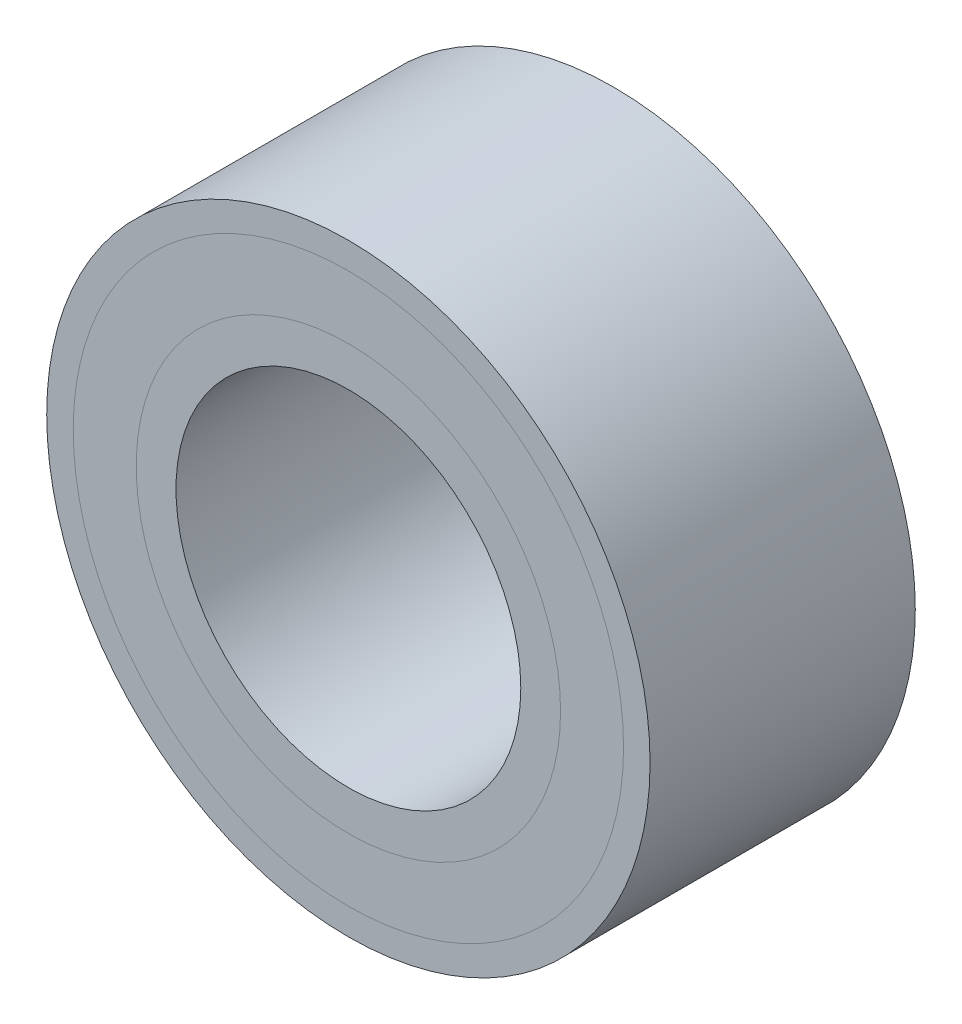
ISO-10303-21;
HEADER;
FILE_DESCRIPTION(('STEP AP214'),'2;1');
FILE_NAME('part.step','',(''),(''),'','','');
FILE_SCHEMA(('AUTOMOTIVE_DESIGN { 1 0 10303 214 1 1 1 1 }'));
ENDSEC;
DATA;
#1=APPLICATION_CONTEXT('core data for automotive mechanical design processes');
#2=APPLICATION_PROTOCOL_DEFINITION('international standard','automotive_design',2000,#1);
#3=PRODUCT_CONTEXT('',#1,'mechanical');
#4=PRODUCT('Part','Part','',(#3));
#5=PRODUCT_RELATED_PRODUCT_CATEGORY('part','',(#4));
#6=PRODUCT_DEFINITION_FORMATION('','',#4);
#7=PRODUCT_DEFINITION_CONTEXT('part definition',#1,'design');
#8=PRODUCT_DEFINITION('design','',#6,#7);
#9=PRODUCT_DEFINITION_SHAPE('','',#8);
#10=(LENGTH_UNIT() NAMED_UNIT(*) SI_UNIT(.MILLI.,.METRE.));
#11=(NAMED_UNIT(*) PLANE_ANGLE_UNIT() SI_UNIT($,.RADIAN.));
#12=(NAMED_UNIT(*) SI_UNIT($,.STERADIAN.) SOLID_ANGLE_UNIT());
#13=UNCERTAINTY_MEASURE_WITH_UNIT(LENGTH_MEASURE(1.E-05),#10,'distance_accuracy_value','');
#14=(GEOMETRIC_REPRESENTATION_CONTEXT(3) GLOBAL_UNCERTAINTY_ASSIGNED_CONTEXT((#13)) GLOBAL_UNIT_ASSIGNED_CONTEXT((#10,
#11,#12)) REPRESENTATION_CONTEXT('',''));
#15=CARTESIAN_POINT('',(0.,0.,0.));
#16=DIRECTION('',(0.,0.,1.));
#17=DIRECTION('',(1.,0.,0.));
#18=AXIS2_PLACEMENT_3D('',#15,#16,#17);
#19=CARTESIAN_POINT('',(0.,0.,40.));
#20=DIRECTION('',(0.,0.,-1.));
#21=DIRECTION('',(-1.,0.,0.));
#22=AXIS2_PLACEMENT_3D('',#19,#20,#21);
#23=CYLINDRICAL_SURFACE('',#22,32.);
#24=CARTESIAN_POINT('',(0.,0.,40.));
#25=DIRECTION('',(0.,0.,1.));
#26=DIRECTION('',(1.,0.,0.));
#27=AXIS2_PLACEMENT_3D('',#24,#25,#26);
#28=CIRCLE('',#27,32.);
#29=CARTESIAN_POINT('',(32.,0.,40.));
#30=VERTEX_POINT('',#29);
#31=EDGE_CURVE('E63',#30,#30,#28,.T.);
#32=ORIENTED_EDGE('',*,*,#31,.T.);
#33=EDGE_LOOP('',(#32));
#34=FACE_BOUND('',#33,.T.);
#35=CARTESIAN_POINT('',(0.,0.,0.));
#36=DIRECTION('',(0.,0.,1.));
#37=DIRECTION('',(1.,0.,0.));
#38=AXIS2_PLACEMENT_3D('',#35,#36,#37);
#39=CIRCLE('',#38,32.);
#40=CARTESIAN_POINT('',(32.,0.,0.));
#41=VERTEX_POINT('',#40);
#42=EDGE_CURVE('E71',#41,#41,#39,.T.);
#43=ORIENTED_EDGE('',*,*,#42,.F.);
#44=EDGE_LOOP('',(#43));
#45=FACE_BOUND('',#44,.T.);
#46=ADVANCED_FACE('F55',(#34,#45),#23,.F.);
#47=CARTESIAN_POINT('',(0.,0.,40.));
#48=DIRECTION('',(0.,0.,-1.));
#49=DIRECTION('',(-1.,0.,0.));
#50=AXIS2_PLACEMENT_3D('',#47,#48,#49);
#51=CYLINDRICAL_SURFACE('',#50,41.5);
#52=CARTESIAN_POINT('',(0.,0.,40.));
#53=DIRECTION('',(0.,0.,1.));
#54=DIRECTION('',(1.,0.,0.));
#55=AXIS2_PLACEMENT_3D('',#52,#53,#54);
#56=CIRCLE('',#55,41.5);
#57=CARTESIAN_POINT('',(41.5,0.,40.));
#58=VERTEX_POINT('',#57);
#59=EDGE_CURVE('E12',#58,#58,#56,.T.);
#60=ORIENTED_EDGE('',*,*,#59,.F.);
#61=EDGE_LOOP('',(#60));
#62=FACE_BOUND('',#61,.T.);
#63=CARTESIAN_POINT('',(0.,0.,0.));
#64=DIRECTION('',(0.,0.,1.));
#65=DIRECTION('',(1.,0.,0.));
#66=AXIS2_PLACEMENT_3D('',#63,#64,#65);
#67=CIRCLE('',#66,41.5);
#68=CARTESIAN_POINT('',(41.5,0.,0.));
#69=VERTEX_POINT('',#68);
#70=EDGE_CURVE('E58',#69,#69,#67,.T.);
#71=ORIENTED_EDGE('',*,*,#70,.T.);
#72=EDGE_LOOP('',(#71));
#73=FACE_BOUND('',#72,.T.);
#74=ADVANCED_FACE('F81',(#62,#73),#51,.T.);
#75=CARTESIAN_POINT('',(0.,0.,40.));
#76=DIRECTION('',(0.,0.,1.));
#77=DIRECTION('',(1.,0.,0.));
#78=AXIS2_PLACEMENT_3D('',#75,#76,#77);
#79=PLANE('',#78);
#80=ORIENTED_EDGE('',*,*,#31,.F.);
#81=EDGE_LOOP('',(#80));
#82=FACE_BOUND('',#81,.T.);
#83=ORIENTED_EDGE('',*,*,#59,.T.);
#84=EDGE_LOOP('',(#83));
#85=FACE_BOUND('',#84,.T.);
#86=ADVANCED_FACE('F85',(#82,#85),#79,.T.);
#87=CARTESIAN_POINT('',(0.,0.,0.));
#88=DIRECTION('',(0.,0.,1.));
#89=DIRECTION('',(1.,0.,0.));
#90=AXIS2_PLACEMENT_3D('',#87,#88,#89);
#91=PLANE('',#90);
#92=ORIENTED_EDGE('',*,*,#42,.T.);
#93=EDGE_LOOP('',(#92));
#94=FACE_BOUND('',#93,.T.);
#95=ORIENTED_EDGE('',*,*,#70,.F.);
#96=EDGE_LOOP('',(#95));
#97=FACE_BOUND('',#96,.T.);
#98=ADVANCED_FACE('F83',(#94,#97),#91,.F.);
#99=CLOSED_SHELL('',(#46,#74,#86,#98));
#100=MANIFOLD_SOLID_BREP('B2',#99);
#101=CARTESIAN_POINT('',(0.,0.,40.));
#102=DIRECTION('',(0.,0.,-1.));
#103=DIRECTION('',(-1.,0.,0.));
#104=AXIS2_PLACEMENT_3D('',#101,#102,#103);
#105=CYLINDRICAL_SURFACE('',#104,26.);
#106=CARTESIAN_POINT('',(0.,0.,40.));
#107=DIRECTION('',(0.,0.,1.));
#108=DIRECTION('',(1.,0.,0.));
#109=AXIS2_PLACEMENT_3D('',#106,#107,#108);
#110=CIRCLE('',#109,26.);
#111=CARTESIAN_POINT('',(26.,0.,40.));
#112=VERTEX_POINT('',#111);
#113=EDGE_CURVE('E137',#112,#112,#110,.T.);
#114=ORIENTED_EDGE('',*,*,#113,.T.);
#115=EDGE_LOOP('',(#114));
#116=FACE_BOUND('',#115,.T.);
#117=CARTESIAN_POINT('',(0.,0.,0.));
#118=DIRECTION('',(0.,0.,1.));
#119=DIRECTION('',(1.,0.,0.));
#120=AXIS2_PLACEMENT_3D('',#117,#118,#119);
#121=CIRCLE('',#120,26.);
#122=CARTESIAN_POINT('',(26.,0.,0.));
#123=VERTEX_POINT('',#122);
#124=EDGE_CURVE('E147',#123,#123,#121,.T.);
#125=ORIENTED_EDGE('',*,*,#124,.F.);
#126=EDGE_LOOP('',(#125));
#127=FACE_BOUND('',#126,.T.);
#128=ADVANCED_FACE('F129',(#116,#127),#105,.F.);
#129=CARTESIAN_POINT('',(0.,0.,40.));
#130=DIRECTION('',(0.,0.,-1.));
#131=DIRECTION('',(-1.,0.,0.));
#132=AXIS2_PLACEMENT_3D('',#129,#130,#131);
#133=CYLINDRICAL_SURFACE('',#132,32.);
#134=CARTESIAN_POINT('',(0.,0.,40.));
#135=DIRECTION('',(0.,0.,1.));
#136=DIRECTION('',(1.,0.,0.));
#137=AXIS2_PLACEMENT_3D('',#134,#135,#136);
#138=CIRCLE('',#137,32.);
#139=CARTESIAN_POINT('',(32.,0.,40.));
#140=VERTEX_POINT('',#139);
#141=EDGE_CURVE('E54',#140,#140,#138,.T.);
#142=ORIENTED_EDGE('',*,*,#141,.F.);
#143=EDGE_LOOP('',(#142));
#144=FACE_BOUND('',#143,.T.);
#145=CARTESIAN_POINT('',(0.,0.,0.));
#146=DIRECTION('',(0.,0.,1.));
#147=DIRECTION('',(1.,0.,0.));
#148=AXIS2_PLACEMENT_3D('',#145,#146,#147);
#149=CIRCLE('',#148,32.);
#150=CARTESIAN_POINT('',(32.,0.,0.));
#151=VERTEX_POINT('',#150);
#152=EDGE_CURVE('E132',#151,#151,#149,.T.);
#153=ORIENTED_EDGE('',*,*,#152,.T.);
#154=EDGE_LOOP('',(#153));
#155=FACE_BOUND('',#154,.T.);
#156=ADVANCED_FACE('F157',(#144,#155),#133,.T.);
#157=CARTESIAN_POINT('',(0.,0.,40.));
#158=DIRECTION('',(0.,0.,1.));
#159=DIRECTION('',(1.,0.,0.));
#160=AXIS2_PLACEMENT_3D('',#157,#158,#159);
#161=PLANE('',#160);
#162=ORIENTED_EDGE('',*,*,#113,.F.);
#163=EDGE_LOOP('',(#162));
#164=FACE_BOUND('',#163,.T.);
#165=ORIENTED_EDGE('',*,*,#141,.T.);
#166=EDGE_LOOP('',(#165));
#167=FACE_BOUND('',#166,.T.);
#168=ADVANCED_FACE('F161',(#164,#167),#161,.T.);
#169=CARTESIAN_POINT('',(0.,0.,0.));
#170=DIRECTION('',(0.,0.,1.));
#171=DIRECTION('',(1.,0.,0.));
#172=AXIS2_PLACEMENT_3D('',#169,#170,#171);
#173=PLANE('',#172);
#174=ORIENTED_EDGE('',*,*,#124,.T.);
#175=EDGE_LOOP('',(#174));
#176=FACE_BOUND('',#175,.T.);
#177=ORIENTED_EDGE('',*,*,#152,.F.);
#178=EDGE_LOOP('',(#177));
#179=FACE_BOUND('',#178,.T.);
#180=ADVANCED_FACE('F159',(#176,#179),#173,.F.);
#181=CLOSED_SHELL('',(#128,#156,#168,#180));
#182=MANIFOLD_SOLID_BREP('B7',#181);
#183=CARTESIAN_POINT('',(0.,0.,40.));
#184=DIRECTION('',(0.,0.,-1.));
#185=DIRECTION('',(-1.,0.,0.));
#186=AXIS2_PLACEMENT_3D('',#183,#184,#185);
#187=CYLINDRICAL_SURFACE('',#186,41.5);
#188=CARTESIAN_POINT('',(0.,0.,40.));
#189=DIRECTION('',(0.,0.,1.));
#190=DIRECTION('',(1.,0.,0.));
#191=AXIS2_PLACEMENT_3D('',#188,#189,#190);
#192=CIRCLE('',#191,41.5);
#193=CARTESIAN_POINT('',(41.5,0.,40.));
#194=VERTEX_POINT('',#193);
#195=EDGE_CURVE('E211',#194,#194,#192,.T.);
#196=ORIENTED_EDGE('',*,*,#195,.T.);
#197=EDGE_LOOP('',(#196));
#198=FACE_BOUND('',#197,.T.);
#199=CARTESIAN_POINT('',(0.,0.,0.));
#200=DIRECTION('',(0.,0.,1.));
#201=DIRECTION('',(1.,0.,0.));
#202=AXIS2_PLACEMENT_3D('',#199,#200,#201);
#203=CIRCLE('',#202,41.5);
#204=CARTESIAN_POINT('',(41.5,0.,0.));
#205=VERTEX_POINT('',#204);
#206=EDGE_CURVE('E218',#205,#205,#203,.T.);
#207=ORIENTED_EDGE('',*,*,#206,.F.);
#208=EDGE_LOOP('',(#207));
#209=FACE_BOUND('',#208,.T.);
#210=ADVANCED_FACE('F204',(#198,#209),#187,.F.);
#211=CARTESIAN_POINT('',(0.,0.,40.));
#212=DIRECTION('',(0.,0.,-1.));
#213=DIRECTION('',(-1.,0.,0.));
#214=AXIS2_PLACEMENT_3D('',#211,#212,#213);
#215=CYLINDRICAL_SURFACE('',#214,45.5);
#216=CARTESIAN_POINT('',(0.,0.,40.));
#217=DIRECTION('',(0.,0.,1.));
#218=DIRECTION('',(1.,0.,0.));
#219=AXIS2_PLACEMENT_3D('',#216,#217,#218);
#220=CIRCLE('',#219,45.5);
#221=CARTESIAN_POINT('',(45.5,0.,40.));
#222=VERTEX_POINT('',#221);
#223=EDGE_CURVE('E128',#222,#222,#220,.T.);
#224=ORIENTED_EDGE('',*,*,#223,.F.);
#225=EDGE_LOOP('',(#224));
#226=FACE_BOUND('',#225,.T.);
#227=CARTESIAN_POINT('',(0.,0.,0.));
#228=DIRECTION('',(0.,0.,1.));
#229=DIRECTION('',(1.,0.,0.));
#230=AXIS2_PLACEMENT_3D('',#227,#228,#229);
#231=CIRCLE('',#230,45.5);
#232=CARTESIAN_POINT('',(45.5,0.,0.));
#233=VERTEX_POINT('',#232);
#234=EDGE_CURVE('E207',#233,#233,#231,.T.);
#235=ORIENTED_EDGE('',*,*,#234,.T.);
#236=EDGE_LOOP('',(#235));
#237=FACE_BOUND('',#236,.T.);
#238=ADVANCED_FACE('F229',(#226,#237),#215,.T.);
#239=CARTESIAN_POINT('',(0.,0.,40.));
#240=DIRECTION('',(0.,0.,1.));
#241=DIRECTION('',(1.,0.,0.));
#242=AXIS2_PLACEMENT_3D('',#239,#240,#241);
#243=PLANE('',#242);
#244=ORIENTED_EDGE('',*,*,#195,.F.);
#245=EDGE_LOOP('',(#244));
#246=FACE_BOUND('',#245,.T.);
#247=ORIENTED_EDGE('',*,*,#223,.T.);
#248=EDGE_LOOP('',(#247));
#249=FACE_BOUND('',#248,.T.);
#250=ADVANCED_FACE('F233',(#246,#249),#243,.T.);
#251=CARTESIAN_POINT('',(0.,0.,0.));
#252=DIRECTION('',(0.,0.,1.));
#253=DIRECTION('',(1.,0.,0.));
#254=AXIS2_PLACEMENT_3D('',#251,#252,#253);
#255=PLANE('',#254);
#256=ORIENTED_EDGE('',*,*,#206,.T.);
#257=EDGE_LOOP('',(#256));
#258=FACE_BOUND('',#257,.T.);
#259=ORIENTED_EDGE('',*,*,#234,.F.);
#260=EDGE_LOOP('',(#259));
#261=FACE_BOUND('',#260,.T.);
#262=ADVANCED_FACE('F231',(#258,#261),#255,.F.);
#263=CLOSED_SHELL('',(#210,#238,#250,#262));
#264=MANIFOLD_SOLID_BREP('B49',#263);
#265=ADVANCED_BREP_SHAPE_REPRESENTATION('',(#18,#100,#182,#264),#14);
#266=SHAPE_DEFINITION_REPRESENTATION(#9,#265);
ENDSEC;
END-ISO-10303-21;
